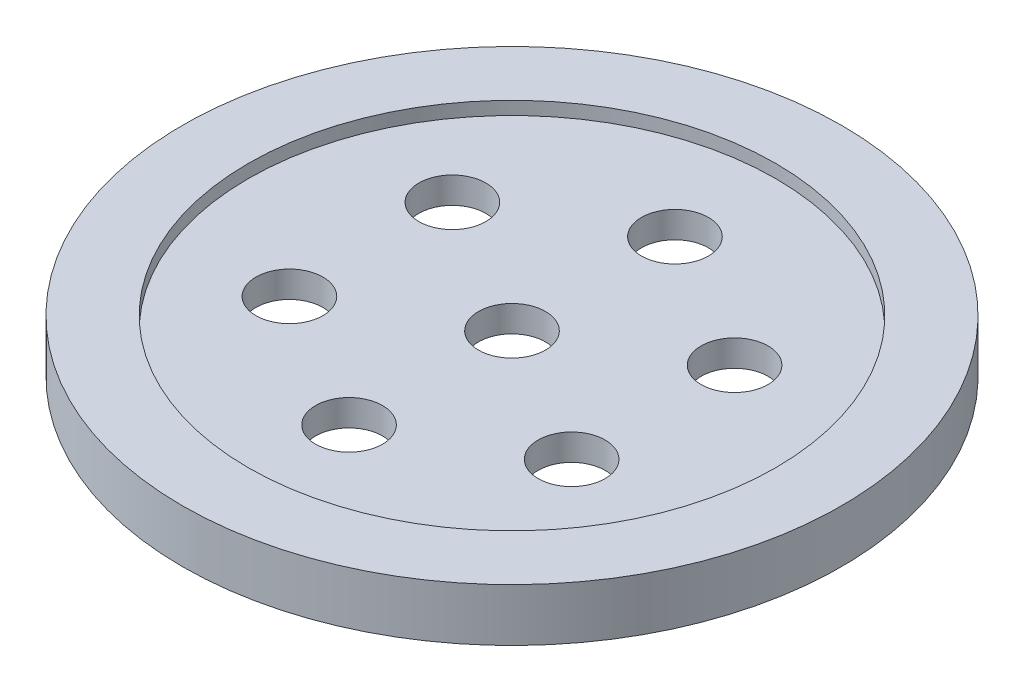
ISO-10303-21;
HEADER;
FILE_DESCRIPTION(('STEP AP214'),'2;1');
FILE_NAME('part.step','',(''),(''),'','','');
FILE_SCHEMA(('AUTOMOTIVE_DESIGN { 1 0 10303 214 1 1 1 1 }'));
ENDSEC;
DATA;
#1=APPLICATION_CONTEXT('core data for automotive mechanical design processes');
#2=APPLICATION_PROTOCOL_DEFINITION('international standard','automotive_design',2000,#1);
#3=PRODUCT_CONTEXT('',#1,'mechanical');
#4=PRODUCT('Part','Part','',(#3));
#5=PRODUCT_RELATED_PRODUCT_CATEGORY('part','',(#4));
#6=PRODUCT_DEFINITION_FORMATION('','',#4);
#7=PRODUCT_DEFINITION_CONTEXT('part definition',#1,'design');
#8=PRODUCT_DEFINITION('design','',#6,#7);
#9=PRODUCT_DEFINITION_SHAPE('','',#8);
#10=(LENGTH_UNIT() NAMED_UNIT(*) SI_UNIT(.MILLI.,.METRE.));
#11=(NAMED_UNIT(*) PLANE_ANGLE_UNIT() SI_UNIT($,.RADIAN.));
#12=(NAMED_UNIT(*) SI_UNIT($,.STERADIAN.) SOLID_ANGLE_UNIT());
#13=UNCERTAINTY_MEASURE_WITH_UNIT(LENGTH_MEASURE(1.E-05),#10,'distance_accuracy_value','');
#14=(GEOMETRIC_REPRESENTATION_CONTEXT(3) GLOBAL_UNCERTAINTY_ASSIGNED_CONTEXT((#13)) GLOBAL_UNIT_ASSIGNED_CONTEXT((#10,
#11,#12)) REPRESENTATION_CONTEXT('',''));
#15=CARTESIAN_POINT('',(0.,0.,0.));
#16=DIRECTION('',(0.,0.,1.));
#17=DIRECTION('',(1.,0.,0.));
#18=AXIS2_PLACEMENT_3D('',#15,#16,#17);
#19=CARTESIAN_POINT('',(0.,113.049804916836,0.));
#20=DIRECTION('',(0.,1.,0.));
#21=DIRECTION('',(0.,0.,1.));
#22=AXIS2_PLACEMENT_3D('',#19,#20,#21);
#23=CYLINDRICAL_SURFACE('',#22,100.);
#24=CARTESIAN_POINT('',(0.,-4.,0.));
#25=DIRECTION('',(0.,1.,0.));
#26=DIRECTION('',(0.,0.,1.));
#27=AXIS2_PLACEMENT_3D('',#24,#25,#26);
#28=CIRCLE('',#27,100.);
#29=CARTESIAN_POINT('',(0.,-4.,100.));
#30=VERTEX_POINT('',#29);
#31=EDGE_CURVE('E66',#30,#30,#28,.T.);
#32=ORIENTED_EDGE('',*,*,#31,.F.);
#33=EDGE_LOOP('',(#32));
#34=FACE_BOUND('',#33,.T.);
#35=CARTESIAN_POINT('',(0.,0.999999999999987,0.));
#36=DIRECTION('',(0.,1.,0.));
#37=DIRECTION('',(0.,0.,1.));
#38=AXIS2_PLACEMENT_3D('',#35,#36,#37);
#39=CIRCLE('',#38,100.);
#40=CARTESIAN_POINT('',(0.,0.999999999999987,100.));
#41=VERTEX_POINT('',#40);
#42=EDGE_CURVE('E10',#41,#41,#39,.T.);
#43=ORIENTED_EDGE('',*,*,#42,.T.);
#44=EDGE_LOOP('',(#43));
#45=FACE_BOUND('',#44,.T.);
#46=ADVANCED_FACE('F38',(#34,#45),#23,.F.);
#47=CARTESIAN_POINT('',(100.,0.999999999999989,0.));
#48=DIRECTION('',(0.,-1.,0.));
#49=DIRECTION('',(0.,0.,-1.));
#50=AXIS2_PLACEMENT_3D('',#47,#48,#49);
#51=PLANE('',#50);
#52=ORIENTED_EDGE('',*,*,#42,.F.);
#53=EDGE_LOOP('',(#52));
#54=FACE_BOUND('',#53,.T.);
#55=CARTESIAN_POINT('',(0.,0.999999999999987,0.));
#56=DIRECTION('',(0.,1.,0.));
#57=DIRECTION('',(0.,0.,1.));
#58=AXIS2_PLACEMENT_3D('',#55,#56,#57);
#59=CIRCLE('',#58,125.);
#60=CARTESIAN_POINT('',(0.,0.999999999999987,125.));
#61=VERTEX_POINT('',#60);
#62=EDGE_CURVE('E44',#61,#61,#59,.T.);
#63=ORIENTED_EDGE('',*,*,#62,.T.);
#64=EDGE_LOOP('',(#63));
#65=FACE_BOUND('',#64,.T.);
#66=ADVANCED_FACE('F137',(#54,#65),#51,.F.);
#67=CARTESIAN_POINT('',(0.,113.049804916836,0.));
#68=DIRECTION('',(0.,1.,0.));
#69=DIRECTION('',(0.,0.,1.));
#70=AXIS2_PLACEMENT_3D('',#67,#68,#69);
#71=CYLINDRICAL_SURFACE('',#70,125.);
#72=ORIENTED_EDGE('',*,*,#62,.F.);
#73=EDGE_LOOP('',(#72));
#74=FACE_BOUND('',#73,.T.);
#75=CARTESIAN_POINT('',(0.,-19.,0.));
#76=DIRECTION('',(0.,1.,0.));
#77=DIRECTION('',(0.,0.,1.));
#78=AXIS2_PLACEMENT_3D('',#75,#76,#77);
#79=CIRCLE('',#78,125.);
#80=CARTESIAN_POINT('',(0.,-19.,125.));
#81=VERTEX_POINT('',#80);
#82=EDGE_CURVE('E48',#81,#81,#79,.T.);
#83=ORIENTED_EDGE('',*,*,#82,.T.);
#84=EDGE_LOOP('',(#83));
#85=FACE_BOUND('',#84,.T.);
#86=ADVANCED_FACE('F141',(#74,#85),#71,.T.);
#87=CARTESIAN_POINT('',(125.,-19.,0.));
#88=DIRECTION('',(0.,1.,0.));
#89=DIRECTION('',(0.,0.,1.));
#90=AXIS2_PLACEMENT_3D('',#87,#88,#89);
#91=PLANE('',#90);
#92=ORIENTED_EDGE('',*,*,#82,.F.);
#93=EDGE_LOOP('',(#92));
#94=FACE_BOUND('',#93,.T.);
#95=CARTESIAN_POINT('',(0.,-19.,0.));
#96=DIRECTION('',(0.,1.,0.));
#97=DIRECTION('',(0.,0.,1.));
#98=AXIS2_PLACEMENT_3D('',#95,#96,#97);
#99=CIRCLE('',#98,100.);
#100=CARTESIAN_POINT('',(0.,-19.,100.));
#101=VERTEX_POINT('',#100);
#102=EDGE_CURVE('E52',#101,#101,#99,.T.);
#103=ORIENTED_EDGE('',*,*,#102,.T.);
#104=EDGE_LOOP('',(#103));
#105=FACE_BOUND('',#104,.T.);
#106=ADVANCED_FACE('F146',(#94,#105),#91,.F.);
#107=CARTESIAN_POINT('',(0.,113.049804916836,0.));
#108=DIRECTION('',(0.,1.,0.));
#109=DIRECTION('',(0.,0.,1.));
#110=AXIS2_PLACEMENT_3D('',#107,#108,#109);
#111=CYLINDRICAL_SURFACE('',#110,100.);
#112=ORIENTED_EDGE('',*,*,#102,.F.);
#113=EDGE_LOOP('',(#112));
#114=FACE_BOUND('',#113,.T.);
#115=CARTESIAN_POINT('',(0.,-14.,0.));
#116=DIRECTION('',(0.,1.,0.));
#117=DIRECTION('',(0.,0.,1.));
#118=AXIS2_PLACEMENT_3D('',#115,#116,#117);
#119=CIRCLE('',#118,100.);
#120=CARTESIAN_POINT('',(0.,-14.,100.));
#121=VERTEX_POINT('',#120);
#122=EDGE_CURVE('E57',#121,#121,#119,.T.);
#123=ORIENTED_EDGE('',*,*,#122,.T.);
#124=EDGE_LOOP('',(#123));
#125=FACE_BOUND('',#124,.T.);
#126=ADVANCED_FACE('F152',(#114,#125),#111,.F.);
#127=CARTESIAN_POINT('',(100.,-14.,0.));
#128=DIRECTION('',(0.,1.,0.));
#129=DIRECTION('',(0.,0.,1.));
#130=AXIS2_PLACEMENT_3D('',#127,#128,#129);
#131=PLANE('',#130);
#132=CARTESIAN_POINT('',(0.,-14.,-61.8014587983455));
#133=DIRECTION('',(0.,1.,0.));
#134=DIRECTION('',(0.,0.,1.));
#135=AXIS2_PLACEMENT_3D('',#132,#133,#134);
#136=CIRCLE('',#135,12.7);
#137=CARTESIAN_POINT('',(0.,-14.,-49.1014587983454));
#138=VERTEX_POINT('',#137);
#139=EDGE_CURVE('E69',#138,#138,#136,.T.);
#140=ORIENTED_EDGE('',*,*,#139,.T.);
#141=EDGE_LOOP('',(#140));
#142=FACE_BOUND('',#141,.T.);
#143=CARTESIAN_POINT('',(-53.5216333103027,-14.,-30.9007293991696));
#144=DIRECTION('',(0.,1.,0.));
#145=DIRECTION('',(0.,0.,1.));
#146=AXIS2_PLACEMENT_3D('',#143,#144,#145);
#147=CIRCLE('',#146,12.7000000000033);
#148=CARTESIAN_POINT('',(-53.5216333103027,-14.,-18.2007293991663));
#149=VERTEX_POINT('',#148);
#150=EDGE_CURVE('E74',#149,#149,#147,.T.);
#151=ORIENTED_EDGE('',*,*,#150,.T.);
#152=EDGE_LOOP('',(#151));
#153=FACE_BOUND('',#152,.T.);
#154=CARTESIAN_POINT('',(-53.5216333102992,-14.,30.9007293991758));
#155=DIRECTION('',(0.,1.,0.));
#156=DIRECTION('',(0.,0.,1.));
#157=AXIS2_PLACEMENT_3D('',#154,#155,#156);
#158=CIRCLE('',#157,12.7000000000065);
#159=CARTESIAN_POINT('',(-53.5216333102992,-14.,43.6007293991823));
#160=VERTEX_POINT('',#159);
#161=EDGE_CURVE('E73',#160,#160,#158,.T.);
#162=ORIENTED_EDGE('',*,*,#161,.T.);
#163=EDGE_LOOP('',(#162));
#164=FACE_BOUND('',#163,.T.);
#165=CARTESIAN_POINT('',(7.01087542562663E-12,-14.,61.8014587983455));
#166=DIRECTION('',(0.,1.,0.));
#167=DIRECTION('',(0.,0.,1.));
#168=AXIS2_PLACEMENT_3D('',#165,#166,#167);
#169=CIRCLE('',#168,12.7000000000071);
#170=CARTESIAN_POINT('',(7.01087542562663E-12,-14.,74.5014587983526));
#171=VERTEX_POINT('',#170);
#172=EDGE_CURVE('E80',#171,#171,#169,.T.);
#173=ORIENTED_EDGE('',*,*,#172,.T.);
#174=EDGE_LOOP('',(#173));
#175=FACE_BOUND('',#174,.T.);
#176=CARTESIAN_POINT('',(53.5216333103097,-14.,30.9007293991697));
#177=DIRECTION('',(0.,1.,0.));
#178=DIRECTION('',(0.,0.,1.));
#179=AXIS2_PLACEMENT_3D('',#176,#177,#178);
#180=CIRCLE('',#179,12.7000000000044);
#181=CARTESIAN_POINT('',(53.5216333103097,-14.,43.6007293991741));
#182=VERTEX_POINT('',#181);
#183=EDGE_CURVE('E86',#182,#182,#180,.T.);
#184=ORIENTED_EDGE('',*,*,#183,.T.);
#185=EDGE_LOOP('',(#184));
#186=FACE_BOUND('',#185,.T.);
#187=CARTESIAN_POINT('',(53.5216333103062,-14.,-30.9007293991758));
#188=DIRECTION('',(0.,1.,0.));
#189=DIRECTION('',(0.,0.,1.));
#190=AXIS2_PLACEMENT_3D('',#187,#188,#189);
#191=CIRCLE('',#190,12.700000000001);
#192=CARTESIAN_POINT('',(53.5216333103062,-14.,-18.2007293991748));
#193=VERTEX_POINT('',#192);
#194=EDGE_CURVE('E92',#193,#193,#191,.T.);
#195=ORIENTED_EDGE('',*,*,#194,.T.);
#196=EDGE_LOOP('',(#195));
#197=FACE_BOUND('',#196,.T.);
#198=ORIENTED_EDGE('',*,*,#122,.F.);
#199=EDGE_LOOP('',(#198));
#200=FACE_BOUND('',#199,.T.);
#201=CARTESIAN_POINT('',(0.,-14.,0.));
#202=DIRECTION('',(0.,1.,0.));
#203=DIRECTION('',(0.,0.,1.));
#204=AXIS2_PLACEMENT_3D('',#201,#202,#203);
#205=CIRCLE('',#204,12.7);
#206=CARTESIAN_POINT('',(0.,-14.,12.7));
#207=VERTEX_POINT('',#206);
#208=EDGE_CURVE('E60',#207,#207,#205,.T.);
#209=ORIENTED_EDGE('',*,*,#208,.T.);
#210=EDGE_LOOP('',(#209));
#211=FACE_BOUND('',#210,.T.);
#212=ADVANCED_FACE('F106',(#142,#153,#164,#175,#186,#197,#200,#211),#131,.F.);
#213=CARTESIAN_POINT('',(0.,113.049804916836,0.));
#214=DIRECTION('',(0.,1.,0.));
#215=DIRECTION('',(0.,0.,1.));
#216=AXIS2_PLACEMENT_3D('',#213,#214,#215);
#217=CYLINDRICAL_SURFACE('',#216,12.7);
#218=ORIENTED_EDGE('',*,*,#208,.F.);
#219=EDGE_LOOP('',(#218));
#220=FACE_BOUND('',#219,.T.);
#221=CARTESIAN_POINT('',(0.,-4.00000000000002,0.));
#222=DIRECTION('',(0.,1.,0.));
#223=DIRECTION('',(0.,0.,1.));
#224=AXIS2_PLACEMENT_3D('',#221,#222,#223);
#225=CIRCLE('',#224,12.7);
#226=CARTESIAN_POINT('',(0.,-4.00000000000002,12.7));
#227=VERTEX_POINT('',#226);
#228=EDGE_CURVE('E63',#227,#227,#225,.T.);
#229=ORIENTED_EDGE('',*,*,#228,.T.);
#230=EDGE_LOOP('',(#229));
#231=FACE_BOUND('',#230,.T.);
#232=ADVANCED_FACE('F120',(#220,#231),#217,.F.);
#233=CARTESIAN_POINT('',(12.7,-4.00000000000001,0.));
#234=DIRECTION('',(0.,-1.,0.));
#235=DIRECTION('',(0.,0.,-1.));
#236=AXIS2_PLACEMENT_3D('',#233,#234,#235);
#237=PLANE('',#236);
#238=CARTESIAN_POINT('',(0.,-4.00000000000001,-61.8014587983455));
#239=DIRECTION('',(0.,1.,0.));
#240=DIRECTION('',(0.,0.,1.));
#241=AXIS2_PLACEMENT_3D('',#238,#239,#240);
#242=CIRCLE('',#241,12.7);
#243=CARTESIAN_POINT('',(0.,-4.00000000000001,-49.1014587983454));
#244=VERTEX_POINT('',#243);
#245=EDGE_CURVE('E95',#244,#244,#242,.T.);
#246=ORIENTED_EDGE('',*,*,#245,.F.);
#247=EDGE_LOOP('',(#246));
#248=FACE_BOUND('',#247,.T.);
#249=CARTESIAN_POINT('',(-53.5216333103027,-4.00000000000001,-30.9007293991696));
#250=DIRECTION('',(0.,1.,0.));
#251=DIRECTION('',(0.,0.,1.));
#252=AXIS2_PLACEMENT_3D('',#249,#250,#251);
#253=CIRCLE('',#252,12.7000000000033);
#254=CARTESIAN_POINT('',(-53.5216333103027,-4.00000000000001,-18.2007293991663));
#255=VERTEX_POINT('',#254);
#256=EDGE_CURVE('E96',#255,#255,#253,.T.);
#257=ORIENTED_EDGE('',*,*,#256,.F.);
#258=EDGE_LOOP('',(#257));
#259=FACE_BOUND('',#258,.T.);
#260=CARTESIAN_POINT('',(-53.5216333102992,-4.00000000000001,30.9007293991758));
#261=DIRECTION('',(0.,1.,0.));
#262=DIRECTION('',(0.,0.,1.));
#263=AXIS2_PLACEMENT_3D('',#260,#261,#262);
#264=CIRCLE('',#263,12.7000000000065);
#265=CARTESIAN_POINT('',(-53.5216333102992,-4.00000000000001,43.6007293991823));
#266=VERTEX_POINT('',#265);
#267=EDGE_CURVE('E70',#266,#266,#264,.T.);
#268=ORIENTED_EDGE('',*,*,#267,.F.);
#269=EDGE_LOOP('',(#268));
#270=FACE_BOUND('',#269,.T.);
#271=CARTESIAN_POINT('',(7.01087542562663E-12,-4.00000000000001,61.8014587983455));
#272=DIRECTION('',(0.,1.,0.));
#273=DIRECTION('',(0.,0.,1.));
#274=AXIS2_PLACEMENT_3D('',#271,#272,#273);
#275=CIRCLE('',#274,12.7000000000071);
#276=CARTESIAN_POINT('',(7.01087542562663E-12,-4.00000000000001,74.5014587983526));
#277=VERTEX_POINT('',#276);
#278=EDGE_CURVE('E77',#277,#277,#275,.T.);
#279=ORIENTED_EDGE('',*,*,#278,.F.);
#280=EDGE_LOOP('',(#279));
#281=FACE_BOUND('',#280,.T.);
#282=CARTESIAN_POINT('',(53.5216333103097,-4.00000000000001,30.9007293991697));
#283=DIRECTION('',(0.,1.,0.));
#284=DIRECTION('',(0.,0.,1.));
#285=AXIS2_PLACEMENT_3D('',#282,#283,#284);
#286=CIRCLE('',#285,12.7000000000044);
#287=CARTESIAN_POINT('',(53.5216333103097,-4.00000000000001,43.6007293991741));
#288=VERTEX_POINT('',#287);
#289=EDGE_CURVE('E83',#288,#288,#286,.T.);
#290=ORIENTED_EDGE('',*,*,#289,.F.);
#291=EDGE_LOOP('',(#290));
#292=FACE_BOUND('',#291,.T.);
#293=CARTESIAN_POINT('',(53.5216333103062,-4.00000000000001,-30.9007293991758));
#294=DIRECTION('',(0.,1.,0.));
#295=DIRECTION('',(0.,0.,1.));
#296=AXIS2_PLACEMENT_3D('',#293,#294,#295);
#297=CIRCLE('',#296,12.700000000001);
#298=CARTESIAN_POINT('',(53.5216333103062,-4.00000000000001,-18.2007293991748));
#299=VERTEX_POINT('',#298);
#300=EDGE_CURVE('E89',#299,#299,#297,.T.);
#301=ORIENTED_EDGE('',*,*,#300,.F.);
#302=EDGE_LOOP('',(#301));
#303=FACE_BOUND('',#302,.T.);
#304=ORIENTED_EDGE('',*,*,#228,.F.);
#305=EDGE_LOOP('',(#304));
#306=FACE_BOUND('',#305,.T.);
#307=ORIENTED_EDGE('',*,*,#31,.T.);
#308=EDGE_LOOP('',(#307));
#309=FACE_BOUND('',#308,.T.);
#310=ADVANCED_FACE('F116',(#248,#259,#270,#281,#292,#303,#306,#309),#237,.F.);
#311=CARTESIAN_POINT('',(53.5216333103062,-14.,-30.9007293991758));
#312=DIRECTION('',(0.,1.,0.));
#313=DIRECTION('',(0.,0.,1.));
#314=AXIS2_PLACEMENT_3D('',#311,#312,#313);
#315=CYLINDRICAL_SURFACE('',#314,12.700000000001);
#316=ORIENTED_EDGE('',*,*,#194,.F.);
#317=EDGE_LOOP('',(#316));
#318=FACE_BOUND('',#317,.T.);
#319=ORIENTED_EDGE('',*,*,#300,.T.);
#320=EDGE_LOOP('',(#319));
#321=FACE_BOUND('',#320,.T.);
#322=ADVANCED_FACE('F119',(#318,#321),#315,.F.);
#323=CARTESIAN_POINT('',(53.5216333103097,-14.,30.9007293991697));
#324=DIRECTION('',(0.,1.,0.));
#325=DIRECTION('',(0.,0.,1.));
#326=AXIS2_PLACEMENT_3D('',#323,#324,#325);
#327=CYLINDRICAL_SURFACE('',#326,12.7000000000044);
#328=ORIENTED_EDGE('',*,*,#183,.F.);
#329=EDGE_LOOP('',(#328));
#330=FACE_BOUND('',#329,.T.);
#331=ORIENTED_EDGE('',*,*,#289,.T.);
#332=EDGE_LOOP('',(#331));
#333=FACE_BOUND('',#332,.T.);
#334=ADVANCED_FACE('F169',(#330,#333),#327,.F.);
#335=CARTESIAN_POINT('',(7.01087542562663E-12,-14.,61.8014587983455));
#336=DIRECTION('',(0.,1.,0.));
#337=DIRECTION('',(0.,0.,1.));
#338=AXIS2_PLACEMENT_3D('',#335,#336,#337);
#339=CYLINDRICAL_SURFACE('',#338,12.7000000000071);
#340=ORIENTED_EDGE('',*,*,#172,.F.);
#341=EDGE_LOOP('',(#340));
#342=FACE_BOUND('',#341,.T.);
#343=ORIENTED_EDGE('',*,*,#278,.T.);
#344=EDGE_LOOP('',(#343));
#345=FACE_BOUND('',#344,.T.);
#346=ADVANCED_FACE('F165',(#342,#345),#339,.F.);
#347=CARTESIAN_POINT('',(-53.5216333102992,-14.,30.9007293991758));
#348=DIRECTION('',(0.,1.,0.));
#349=DIRECTION('',(0.,0.,1.));
#350=AXIS2_PLACEMENT_3D('',#347,#348,#349);
#351=CYLINDRICAL_SURFACE('',#350,12.7000000000065);
#352=ORIENTED_EDGE('',*,*,#161,.F.);
#353=EDGE_LOOP('',(#352));
#354=FACE_BOUND('',#353,.T.);
#355=ORIENTED_EDGE('',*,*,#267,.T.);
#356=EDGE_LOOP('',(#355));
#357=FACE_BOUND('',#356,.T.);
#358=ADVANCED_FACE('F162',(#354,#357),#351,.F.);
#359=CARTESIAN_POINT('',(-53.5216333103027,-14.,-30.9007293991696));
#360=DIRECTION('',(0.,1.,0.));
#361=DIRECTION('',(0.,0.,1.));
#362=AXIS2_PLACEMENT_3D('',#359,#360,#361);
#363=CYLINDRICAL_SURFACE('',#362,12.7000000000033);
#364=ORIENTED_EDGE('',*,*,#150,.F.);
#365=EDGE_LOOP('',(#364));
#366=FACE_BOUND('',#365,.T.);
#367=ORIENTED_EDGE('',*,*,#256,.T.);
#368=EDGE_LOOP('',(#367));
#369=FACE_BOUND('',#368,.T.);
#370=ADVANCED_FACE('F112',(#366,#369),#363,.F.);
#371=CARTESIAN_POINT('',(0.,-14.,-61.8014587983455));
#372=DIRECTION('',(0.,1.,0.));
#373=DIRECTION('',(0.,0.,1.));
#374=AXIS2_PLACEMENT_3D('',#371,#372,#373);
#375=CYLINDRICAL_SURFACE('',#374,12.7);
#376=ORIENTED_EDGE('',*,*,#139,.F.);
#377=EDGE_LOOP('',(#376));
#378=FACE_BOUND('',#377,.T.);
#379=ORIENTED_EDGE('',*,*,#245,.T.);
#380=EDGE_LOOP('',(#379));
#381=FACE_BOUND('',#380,.T.);
#382=ADVANCED_FACE('F109',(#378,#381),#375,.F.);
#383=CLOSED_SHELL('',(#46,#66,#86,#106,#126,#212,#232,#310,#322,#334,#346,#358,#370,#382));
#384=MANIFOLD_SOLID_BREP('B2',#383);
#385=ADVANCED_BREP_SHAPE_REPRESENTATION('',(#18,#384),#14);
#386=SHAPE_DEFINITION_REPRESENTATION(#9,#385);
ENDSEC;
END-ISO-10303-21;
